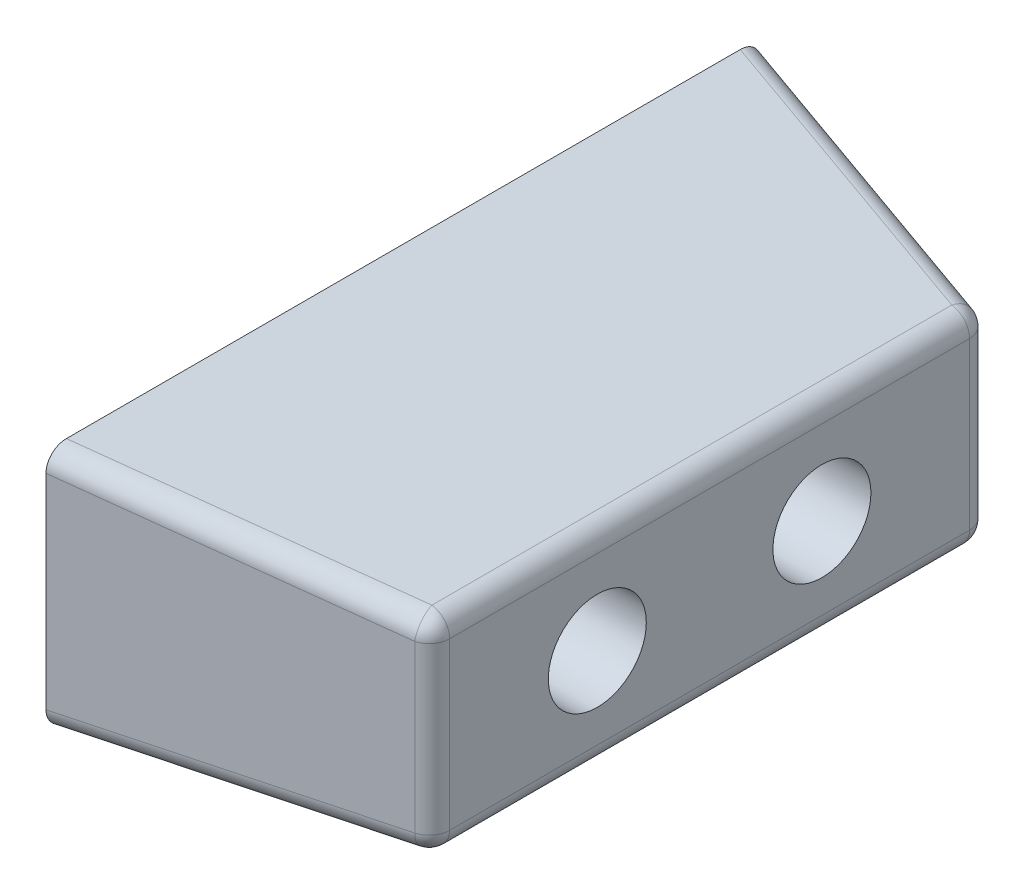
ISO-10303-21;
HEADER;
FILE_DESCRIPTION(('STEP AP214'),'2;1');
FILE_NAME('part.step','',(''),(''),'','','');
FILE_SCHEMA(('AUTOMOTIVE_DESIGN { 1 0 10303 214 1 1 1 1 }'));
ENDSEC;
DATA;
#1=APPLICATION_CONTEXT('core data for automotive mechanical design processes');
#2=APPLICATION_PROTOCOL_DEFINITION('international standard','automotive_design',2000,#1);
#3=PRODUCT_CONTEXT('',#1,'mechanical');
#4=PRODUCT('Part','Part','',(#3));
#5=PRODUCT_RELATED_PRODUCT_CATEGORY('part','',(#4));
#6=PRODUCT_DEFINITION_FORMATION('','',#4);
#7=PRODUCT_DEFINITION_CONTEXT('part definition',#1,'design');
#8=PRODUCT_DEFINITION('design','',#6,#7);
#9=PRODUCT_DEFINITION_SHAPE('','',#8);
#10=(LENGTH_UNIT() NAMED_UNIT(*) SI_UNIT(.MILLI.,.METRE.));
#11=(NAMED_UNIT(*) PLANE_ANGLE_UNIT() SI_UNIT($,.RADIAN.));
#12=(NAMED_UNIT(*) SI_UNIT($,.STERADIAN.) SOLID_ANGLE_UNIT());
#13=UNCERTAINTY_MEASURE_WITH_UNIT(LENGTH_MEASURE(1.E-05),#10,'distance_accuracy_value','');
#14=(GEOMETRIC_REPRESENTATION_CONTEXT(3) GLOBAL_UNCERTAINTY_ASSIGNED_CONTEXT((#13)) GLOBAL_UNIT_ASSIGNED_CONTEXT((#10,
#11,#12)) REPRESENTATION_CONTEXT('',''));
#15=CARTESIAN_POINT('',(0.,0.,0.));
#16=DIRECTION('',(0.,0.,1.));
#17=DIRECTION('',(1.,0.,0.));
#18=AXIS2_PLACEMENT_3D('',#15,#16,#17);
#19=CARTESIAN_POINT('',(0.,4.44089209850063E-13,87.5));
#20=DIRECTION('',(0.,1.,0.));
#21=DIRECTION('',(0.,0.,1.));
#22=AXIS2_PLACEMENT_3D('',#19,#20,#21);
#23=PLANE('',#22);
#24=DIRECTION('',(0.,0.,-1.));
#25=VECTOR('',#24,1.);
#26=CARTESIAN_POINT('',(0.,4.44089209850063E-13,87.5));
#27=LINE('',#26,#25);
#28=CARTESIAN_POINT('',(0.,4.44089209850063E-13,82.3252751012467));
#29=VERTEX_POINT('',#28);
#30=CARTESIAN_POINT('',(0.,4.44089209850063E-13,-82.3252751012466));
#31=VERTEX_POINT('',#30);
#32=EDGE_CURVE('E127',#29,#31,#27,.T.);
#33=ORIENTED_EDGE('',*,*,#32,.T.);
#34=DIRECTION('',(-0.966234939601246,0.,-0.257662650560332));
#35=VECTOR('',#34,1.);
#36=CARTESIAN_POINT('',(42.2801514774888,4.44089209850063E-13,-71.0505680405829));
#37=LINE('',#36,#35);
#38=CARTESIAN_POINT('',(69.9999999999999,4.44089209850063E-13,-63.6586084345799));
#39=VERTEX_POINT('',#38);
#40=EDGE_CURVE('E156',#31,#39,#37,.F.);
#41=ORIENTED_EDGE('',*,*,#40,.T.);
#42=DIRECTION('',(0.,0.,-1.));
#43=VECTOR('',#42,1.);
#44=CARTESIAN_POINT('',(69.9999999999999,4.44089209850063E-13,87.5));
#45=LINE('',#44,#43);
#46=CARTESIAN_POINT('',(69.9999999999999,4.44089209850063E-13,63.65860843458));
#47=VERTEX_POINT('',#46);
#48=EDGE_CURVE('E154',#39,#47,#45,.F.);
#49=ORIENTED_EDGE('',*,*,#48,.T.);
#50=DIRECTION('',(0.966234939601246,0.,-0.257662650560332));
#51=VECTOR('',#50,1.);
#52=CARTESIAN_POINT('',(-1.28831325280166,4.44089209850063E-13,82.6688253019938));
#53=LINE('',#52,#51);
#54=EDGE_CURVE('E152',#47,#29,#53,.F.);
#55=ORIENTED_EDGE('',*,*,#54,.T.);
#56=EDGE_LOOP('',(#33,#41,#49,#55));
#57=FACE_BOUND('',#56,.T.);
#58=ADVANCED_FACE('F34',(#57),#23,.F.);
#59=CARTESIAN_POINT('',(74.9999999999999,0.,87.5));
#60=DIRECTION('',(-1.,0.,0.));
#61=DIRECTION('',(0.,0.,1.));
#62=AXIS2_PLACEMENT_3D('',#59,#60,#61);
#63=PLANE('',#62);
#64=DIRECTION('',(0.,0.,-1.));
#65=VECTOR('',#64,1.);
#66=CARTESIAN_POINT('',(74.9999999999999,5.00000000000044,87.5));
#67=LINE('',#66,#65);
#68=CARTESIAN_POINT('',(74.9999999999999,5.00000000000044,63.65860843458));
#69=VERTEX_POINT('',#68);
#70=CARTESIAN_POINT('',(74.9999999999999,5.00000000000044,-63.65860843458));
#71=VERTEX_POINT('',#70);
#72=EDGE_CURVE('E162',#69,#71,#67,.T.);
#73=ORIENTED_EDGE('',*,*,#72,.T.);
#74=DIRECTION('',(0.,-1.,0.));
#75=VECTOR('',#74,1.);
#76=CARTESIAN_POINT('',(74.9999999999999,0.,-63.65860843458));
#77=LINE('',#76,#75);
#78=CARTESIAN_POINT('',(74.9999999999999,45.6224180165261,-63.65860843458));
#79=VERTEX_POINT('',#78);
#80=EDGE_CURVE('E164',#71,#79,#77,.F.);
#81=ORIENTED_EDGE('',*,*,#80,.T.);
#82=DIRECTION('',(0.,0.,-1.));
#83=VECTOR('',#82,1.);
#84=CARTESIAN_POINT('',(74.9999999999999,45.6224180165261,87.5));
#85=LINE('',#84,#83);
#86=CARTESIAN_POINT('',(74.9999999999999,45.6224180165261,63.65860843458));
#87=VERTEX_POINT('',#86);
#88=EDGE_CURVE('E158',#79,#87,#85,.F.);
#89=ORIENTED_EDGE('',*,*,#88,.T.);
#90=DIRECTION('',(0.,-1.,0.));
#91=VECTOR('',#90,1.);
#92=CARTESIAN_POINT('',(74.9999999999999,0.,63.65860843458));
#93=LINE('',#92,#91);
#94=EDGE_CURVE('E160',#87,#69,#93,.T.);
#95=ORIENTED_EDGE('',*,*,#94,.T.);
#96=EDGE_LOOP('',(#73,#81,#89,#95));
#97=FACE_BOUND('',#96,.T.);
#98=CARTESIAN_POINT('',(75.0000000000001,25.,27.5));
#99=DIRECTION('',(1.,0.,0.));
#100=DIRECTION('',(0.,0.,-1.));
#101=AXIS2_PLACEMENT_3D('',#98,#99,#100);
#102=CIRCLE('',#101,12.);
#103=CARTESIAN_POINT('',(75.0000000000001,25.,15.5));
#104=VERTEX_POINT('',#103);
#105=EDGE_CURVE('E219',#104,#104,#102,.T.);
#106=ORIENTED_EDGE('',*,*,#105,.F.);
#107=EDGE_LOOP('',(#106));
#108=FACE_BOUND('',#107,.T.);
#109=CARTESIAN_POINT('',(75.0000000000001,25.,-27.5));
#110=DIRECTION('',(1.,0.,0.));
#111=DIRECTION('',(0.,0.,1.));
#112=AXIS2_PLACEMENT_3D('',#109,#110,#111);
#113=CIRCLE('',#112,12.);
#114=CARTESIAN_POINT('',(75.0000000000001,25.,-39.5));
#115=VERTEX_POINT('',#114);
#116=EDGE_CURVE('E225',#115,#115,#113,.T.);
#117=ORIENTED_EDGE('',*,*,#116,.F.);
#118=EDGE_LOOP('',(#117));
#119=FACE_BOUND('',#118,.T.);
#120=ADVANCED_FACE('F253',(#97,#108,#119),#63,.F.);
#121=CARTESIAN_POINT('',(75.,49.9999999999999,87.4999999999999));
#122=DIRECTION('',(-0.132163720091018,-0.991227900682635,0.));
#123=DIRECTION('',(0.991227900682635,-0.132163720091018,0.));
#124=AXIS2_PLACEMENT_3D('',#121,#122,#123);
#125=PLANE('',#124);
#126=DIRECTION('',(0.,0.,-1.));
#127=VECTOR('',#126,1.);
#128=CARTESIAN_POINT('',(70.660818600455,50.5785575199393,87.4999999999999));
#129=LINE('',#128,#127);
#130=CARTESIAN_POINT('',(70.660818600455,50.5785575199393,63.65860843458));
#131=VERTEX_POINT('',#130);
#132=CARTESIAN_POINT('',(70.660818600455,50.5785575199393,-63.6586084345799));
#133=VERTEX_POINT('',#132);
#134=EDGE_CURVE('E133',#131,#133,#129,.T.);
#135=ORIENTED_EDGE('',*,*,#134,.T.);
#136=DIRECTION('',(-0.95831484749991,0.127775312999988,-0.255550625999976));
#137=VECTOR('',#136,1.);
#138=CARTESIAN_POINT('',(111.735059606866,45.1019920524179,-52.7054774995371));
#139=LINE('',#138,#137);
#140=CARTESIAN_POINT('',(0.,60.0000000000004,-82.5014933947013));
#141=VERTEX_POINT('',#140);
#142=EDGE_CURVE('E119',#133,#141,#139,.T.);
#143=ORIENTED_EDGE('',*,*,#142,.T.);
#144=DIRECTION('',(0.,0.,-1.));
#145=VECTOR('',#144,1.);
#146=CARTESIAN_POINT('',(0.,60.0000000000004,87.5));
#147=LINE('',#146,#145);
#148=CARTESIAN_POINT('',(0.,60.0000000000004,82.5014933947014));
#149=VERTEX_POINT('',#148);
#150=EDGE_CURVE('E114',#149,#141,#147,.T.);
#151=ORIENTED_EDGE('',*,*,#150,.F.);
#152=DIRECTION('',(0.95831484749991,-0.127775312999988,-0.255550625999976));
#153=VECTOR('',#152,1.);
#154=CARTESIAN_POINT('',(68.8779167497228,50.8162777667036,64.1340489281086));
#155=LINE('',#154,#153);
#156=EDGE_CURVE('E124',#149,#131,#155,.T.);
#157=ORIENTED_EDGE('',*,*,#156,.T.);
#158=EDGE_LOOP('',(#135,#143,#151,#157));
#159=FACE_BOUND('',#158,.T.);
#160=ADVANCED_FACE('F123',(#159),#125,.F.);
#161=CARTESIAN_POINT('',(0.,4.44089209850063E-13,87.5));
#162=DIRECTION('',(1.,0.,0.));
#163=DIRECTION('',(0.,0.,-1.));
#164=AXIS2_PLACEMENT_3D('',#161,#162,#163);
#165=PLANE('',#164);
#166=CARTESIAN_POINT('',(1.11022302462516E-13,25.,27.5));
#167=DIRECTION('',(1.,0.,0.));
#168=DIRECTION('',(0.,0.,-1.));
#169=AXIS2_PLACEMENT_3D('',#166,#167,#168);
#170=CIRCLE('',#169,5.5);
#171=CARTESIAN_POINT('',(1.11022302462516E-13,25.,22.));
#172=VERTEX_POINT('',#171);
#173=EDGE_CURVE('E137',#172,#172,#170,.T.);
#174=ORIENTED_EDGE('',*,*,#173,.T.);
#175=EDGE_LOOP('',(#174));
#176=FACE_BOUND('',#175,.T.);
#177=CARTESIAN_POINT('',(3.33066907387547E-13,25.,-27.5));
#178=DIRECTION('',(1.,0.,0.));
#179=DIRECTION('',(0.,0.,-1.));
#180=AXIS2_PLACEMENT_3D('',#177,#178,#179);
#181=CIRCLE('',#180,5.5);
#182=CARTESIAN_POINT('',(3.33066907387547E-13,25.,-33.));
#183=VERTEX_POINT('',#182);
#184=EDGE_CURVE('E212',#183,#183,#181,.T.);
#185=ORIENTED_EDGE('',*,*,#184,.T.);
#186=EDGE_LOOP('',(#185));
#187=FACE_BOUND('',#186,.T.);
#188=ORIENTED_EDGE('',*,*,#150,.T.);
#189=CARTESIAN_POINT('',(0.,54.9557513498594,-82.3252751012466));
#190=DIRECTION('',(1.,0.,0.));
#191=DIRECTION('',(0.,0.447213595499958,-0.894427190999916));
#192=AXIS2_PLACEMENT_3D('',#189,#190,#191);
#193=ELLIPSE('',#192,5.21749194749951,5.);
#194=CARTESIAN_POINT('',(0.,55.127526450233,-87.5));
#195=VERTEX_POINT('',#194);
#196=EDGE_CURVE('E144',#141,#195,#193,.F.);
#197=ORIENTED_EDGE('',*,*,#196,.T.);
#198=DIRECTION('',(0.,-1.,0.));
#199=VECTOR('',#198,1.);
#200=CARTESIAN_POINT('',(0.,0.,-87.5));
#201=LINE('',#200,#199);
#202=CARTESIAN_POINT('',(0.,5.00000000000045,-87.5));
#203=VERTEX_POINT('',#202);
#204=EDGE_CURVE('E218',#195,#203,#201,.T.);
#205=ORIENTED_EDGE('',*,*,#204,.T.);
#206=CARTESIAN_POINT('',(0.,5.00000000000045,-82.3252751012466));
#207=DIRECTION('',(1.,0.,0.));
#208=DIRECTION('',(0.,0.,-1.));
#209=AXIS2_PLACEMENT_3D('',#206,#207,#208);
#210=ELLIPSE('',#209,5.17472489875334,5.);
#211=EDGE_CURVE('E142',#203,#31,#210,.F.);
#212=ORIENTED_EDGE('',*,*,#211,.T.);
#213=ORIENTED_EDGE('',*,*,#32,.F.);
#214=CARTESIAN_POINT('',(0.,5.00000000000045,82.3252751012467));
#215=DIRECTION('',(1.,0.,0.));
#216=DIRECTION('',(0.,0.,-1.));
#217=AXIS2_PLACEMENT_3D('',#214,#215,#216);
#218=ELLIPSE('',#217,5.17472489875334,5.);
#219=CARTESIAN_POINT('',(0.,5.00000000000045,87.5));
#220=VERTEX_POINT('',#219);
#221=EDGE_CURVE('E118',#29,#220,#218,.F.);
#222=ORIENTED_EDGE('',*,*,#221,.T.);
#223=DIRECTION('',(0.,-1.,0.));
#224=VECTOR('',#223,1.);
#225=CARTESIAN_POINT('',(0.,4.44089209850063E-13,87.5));
#226=LINE('',#225,#224);
#227=CARTESIAN_POINT('',(0.,55.127526450233,87.5));
#228=VERTEX_POINT('',#227);
#229=EDGE_CURVE('E115',#228,#220,#226,.T.);
#230=ORIENTED_EDGE('',*,*,#229,.F.);
#231=CARTESIAN_POINT('',(0.,54.9557513498594,82.3252751012467));
#232=DIRECTION('',(1.,0.,0.));
#233=DIRECTION('',(0.,-0.447213595499958,-0.894427190999916));
#234=AXIS2_PLACEMENT_3D('',#231,#232,#233);
#235=ELLIPSE('',#234,5.21749194749951,5.);
#236=EDGE_CURVE('E111',#228,#149,#235,.F.);
#237=ORIENTED_EDGE('',*,*,#236,.T.);
#238=EDGE_LOOP('',(#188,#197,#205,#212,#213,#222,#230,#237));
#239=FACE_BOUND('',#238,.T.);
#240=ADVANCED_FACE('F113',(#176,#187,#239),#165,.F.);
#241=CARTESIAN_POINT('',(1.11022302462516E-13,175.,-87.4999999999999));
#242=DIRECTION('',(-0.257662650560332,0.,0.966234939601246));
#243=DIRECTION('',(0.966234939601246,0.,0.257662650560332));
#244=AXIS2_PLACEMENT_3D('',#241,#242,#243);
#245=PLANE('',#244);
#246=ORIENTED_EDGE('',*,*,#204,.F.);
#247=DIRECTION('',(-0.95831484749991,0.127775312999988,-0.255550625999976));
#248=VECTOR('',#247,1.);
#249=CARTESIAN_POINT('',(-14.6782620673183,57.0846280592088,-91.4142032179515));
#250=LINE('',#249,#248);
#251=CARTESIAN_POINT('',(71.2883132528016,45.6224180165261,-68.4897831325862));
#252=VERTEX_POINT('',#251);
#253=EDGE_CURVE('E150',#195,#252,#250,.F.);
#254=ORIENTED_EDGE('',*,*,#253,.T.);
#255=DIRECTION('',(0.,-1.,0.));
#256=VECTOR('',#255,1.);
#257=CARTESIAN_POINT('',(71.2883132528016,175.,-68.4897831325862));
#258=LINE('',#257,#256);
#259=CARTESIAN_POINT('',(71.2883132528016,5.00000000000045,-68.4897831325862));
#260=VERTEX_POINT('',#259);
#261=EDGE_CURVE('E146',#252,#260,#258,.T.);
#262=ORIENTED_EDGE('',*,*,#261,.T.);
#263=DIRECTION('',(-0.966234939601246,0.,-0.257662650560332));
#264=VECTOR('',#263,1.);
#265=CARTESIAN_POINT('',(1.11022302462516E-13,5.00000000000045,-87.4999999999999));
#266=LINE('',#265,#264);
#267=EDGE_CURVE('E148',#260,#203,#266,.T.);
#268=ORIENTED_EDGE('',*,*,#267,.T.);
#269=EDGE_LOOP('',(#246,#254,#262,#268));
#270=FACE_BOUND('',#269,.T.);
#271=ADVANCED_FACE('F313',(#270),#245,.F.);
#272=CARTESIAN_POINT('',(0.,175.,87.5));
#273=DIRECTION('',(-0.257662650560332,0.,-0.966234939601246));
#274=DIRECTION('',(-0.966234939601246,0.,0.257662650560332));
#275=AXIS2_PLACEMENT_3D('',#272,#273,#274);
#276=PLANE('',#275);
#277=ORIENTED_EDGE('',*,*,#229,.T.);
#278=DIRECTION('',(0.966234939601246,0.,-0.257662650560332));
#279=VECTOR('',#278,1.);
#280=CARTESIAN_POINT('',(0.,5.00000000000045,87.5));
#281=LINE('',#280,#279);
#282=CARTESIAN_POINT('',(71.2883132528016,5.00000000000045,68.4897831325863));
#283=VERTEX_POINT('',#282);
#284=EDGE_CURVE('E11',#220,#283,#281,.T.);
#285=ORIENTED_EDGE('',*,*,#284,.T.);
#286=DIRECTION('',(0.,-1.,0.));
#287=VECTOR('',#286,1.);
#288=CARTESIAN_POINT('',(71.2883132528016,175.,68.4897831325863));
#289=LINE('',#288,#287);
#290=CARTESIAN_POINT('',(71.2883132528016,45.6224180165261,68.4897831325863));
#291=VERTEX_POINT('',#290);
#292=EDGE_CURVE('E43',#283,#291,#289,.F.);
#293=ORIENTED_EDGE('',*,*,#292,.T.);
#294=DIRECTION('',(0.95831484749991,-0.127775312999988,-0.255550625999976));
#295=VECTOR('',#294,1.);
#296=CARTESIAN_POINT('',(-14.6782620673184,57.0846280592088,91.4142032179516));
#297=LINE('',#296,#295);
#298=EDGE_CURVE('E167',#291,#228,#297,.F.);
#299=ORIENTED_EDGE('',*,*,#298,.T.);
#300=EDGE_LOOP('',(#277,#285,#293,#299));
#301=FACE_BOUND('',#300,.T.);
#302=ADVANCED_FACE('F325',(#301),#276,.F.);
#303=CARTESIAN_POINT('',(23.,25.,-27.5));
#304=DIRECTION('',(1.,0.,0.));
#305=DIRECTION('',(0.,0.,-1.));
#306=AXIS2_PLACEMENT_3D('',#303,#304,#305);
#307=CYLINDRICAL_SURFACE('',#306,12.);
#308=CARTESIAN_POINT('',(23.,25.,-27.5));
#309=DIRECTION('',(1.,0.,0.));
#310=DIRECTION('',(0.,0.,1.));
#311=AXIS2_PLACEMENT_3D('',#308,#309,#310);
#312=CIRCLE('',#311,12.);
#313=CARTESIAN_POINT('',(23.,25.,-39.5));
#314=VERTEX_POINT('',#313);
#315=EDGE_CURVE('E222',#314,#314,#312,.T.);
#316=CARTESIAN_POINT('',(23.,25.,-39.5));
#317=CARTESIAN_POINT('',(23.5416666666667,25.,-39.5));
#318=CARTESIAN_POINT('',(24.0833333333334,25.,-39.5));
#319=CARTESIAN_POINT('',(25.1666666666667,25.,-39.5));
#320=CARTESIAN_POINT('',(25.7083333333334,25.,-39.5));
#321=CARTESIAN_POINT('',(26.7916666666667,25.,-39.5));
#322=CARTESIAN_POINT('',(27.3333333333334,25.,-39.5));
#323=CARTESIAN_POINT('',(28.4166666666667,25.,-39.5));
#324=CARTESIAN_POINT('',(28.9583333333334,25.,-39.5));
#325=CARTESIAN_POINT('',(30.0416666666667,25.,-39.5));
#326=CARTESIAN_POINT('',(30.5833333333334,25.,-39.5));
#327=CARTESIAN_POINT('',(31.6666666666667,25.,-39.5));
#328=CARTESIAN_POINT('',(32.2083333333334,25.,-39.5));
#329=CARTESIAN_POINT('',(33.2916666666667,25.,-39.5));
#330=CARTESIAN_POINT('',(33.8333333333334,25.,-39.5));
#331=CARTESIAN_POINT('',(34.9166666666667,25.,-39.5));
#332=CARTESIAN_POINT('',(35.4583333333334,25.,-39.5));
#333=CARTESIAN_POINT('',(36.5416666666667,25.,-39.5));
#334=CARTESIAN_POINT('',(37.0833333333334,25.,-39.5));
#335=CARTESIAN_POINT('',(38.1666666666667,25.,-39.5));
#336=CARTESIAN_POINT('',(38.7083333333334,25.,-39.5));
#337=CARTESIAN_POINT('',(39.7916666666667,25.,-39.5));
#338=CARTESIAN_POINT('',(40.3333333333334,25.,-39.5));
#339=CARTESIAN_POINT('',(41.4166666666667,25.,-39.5));
#340=CARTESIAN_POINT('',(41.9583333333334,25.,-39.5));
#341=CARTESIAN_POINT('',(43.0416666666667,25.,-39.5));
#342=CARTESIAN_POINT('',(43.5833333333334,25.,-39.5));
#343=CARTESIAN_POINT('',(44.6666666666667,25.,-39.5));
#344=CARTESIAN_POINT('',(45.2083333333334,25.,-39.5));
#345=CARTESIAN_POINT('',(46.2916666666667,25.,-39.5));
#346=CARTESIAN_POINT('',(46.8333333333334,25.,-39.5));
#347=CARTESIAN_POINT('',(47.9166666666667,25.,-39.5));
#348=CARTESIAN_POINT('',(48.4583333333334,25.,-39.5));
#349=CARTESIAN_POINT('',(49.5416666666667,25.,-39.5));
#350=CARTESIAN_POINT('',(50.0833333333334,25.,-39.5));
#351=CARTESIAN_POINT('',(51.1666666666667,25.,-39.5));
#352=CARTESIAN_POINT('',(51.7083333333334,25.,-39.5));
#353=CARTESIAN_POINT('',(52.7916666666667,25.,-39.5));
#354=CARTESIAN_POINT('',(53.3333333333334,25.,-39.5));
#355=CARTESIAN_POINT('',(54.4166666666667,25.,-39.5));
#356=CARTESIAN_POINT('',(54.9583333333334,25.,-39.5));
#357=CARTESIAN_POINT('',(56.0416666666667,25.,-39.5));
#358=CARTESIAN_POINT('',(56.5833333333334,25.,-39.5));
#359=CARTESIAN_POINT('',(57.6666666666667,25.,-39.5));
#360=CARTESIAN_POINT('',(58.2083333333334,25.,-39.5));
#361=CARTESIAN_POINT('',(59.2916666666667,25.,-39.5));
#362=CARTESIAN_POINT('',(59.8333333333334,25.,-39.5));
#363=CARTESIAN_POINT('',(60.9166666666667,25.,-39.5));
#364=CARTESIAN_POINT('',(61.4583333333334,25.,-39.5));
#365=CARTESIAN_POINT('',(62.5416666666667,25.,-39.5));
#366=CARTESIAN_POINT('',(63.0833333333334,25.,-39.5));
#367=CARTESIAN_POINT('',(64.1666666666667,25.,-39.5));
#368=CARTESIAN_POINT('',(64.7083333333334,25.,-39.5));
#369=CARTESIAN_POINT('',(65.7916666666667,25.,-39.5));
#370=CARTESIAN_POINT('',(66.3333333333334,25.,-39.5));
#371=CARTESIAN_POINT('',(67.4166666666667,25.,-39.5));
#372=CARTESIAN_POINT('',(67.9583333333334,25.,-39.5));
#373=CARTESIAN_POINT('',(69.0416666666667,25.,-39.5));
#374=CARTESIAN_POINT('',(69.5833333333334,25.,-39.5));
#375=CARTESIAN_POINT('',(70.6666666666667,25.,-39.5));
#376=CARTESIAN_POINT('',(71.2083333333334,25.,-39.5));
#377=CARTESIAN_POINT('',(72.2916666666667,25.,-39.5));
#378=CARTESIAN_POINT('',(72.8333333333334,25.,-39.5));
#379=CARTESIAN_POINT('',(73.9166666666667,25.,-39.5));
#380=CARTESIAN_POINT('',(74.4583333333334,25.,-39.5));
#381=CARTESIAN_POINT('',(75.0000000000001,25.,-39.5));
#382=B_SPLINE_CURVE_WITH_KNOTS('',3,(#316,#317,#318,#319,#320,#321,#322,#323,#324,#325,#326,
#327,#328,#329,#330,#331,#332,#333,#334,#335,#336,#337,#338,#339,#340,#341,#342,#343,#344,#345,
#346,#347,#348,#349,#350,#351,#352,#353,#354,#355,#356,#357,#358,#359,#360,#361,#362,#363,#364,
#365,#366,#367,#368,#369,#370,#371,#372,#373,#374,#375,#376,#377,#378,#379,#380,#381),
.UNSPECIFIED.,.F.,.F.,(4,2,2,2,2,2,2,2,2,2,2,2,2,2,2,2,2,2,2,2,2,2,2,2,2,2,2,2,2,2,2,2,4),(0.,
1.625,3.25000000000001,4.87500000000001,6.50000000000001,8.12500000000001,9.75000000000001,
11.375,13.,14.625,16.25,17.875,19.5,21.125,22.75,24.375,26.,27.625,29.25,30.875,32.5,34.125,
35.75,37.375,39.,40.625,42.25,43.875,45.5,47.1250000000001,48.75,50.3750000000001,52.),.UNSPECIFIED.);
#383=EDGE_CURVE('BSEAM327',#314,#115,#382,.T.);
#384=ORIENTED_EDGE('',*,*,#315,.F.);
#385=ORIENTED_EDGE('',*,*,#116,.T.);
#386=ORIENTED_EDGE('',*,*,#383,.T.);
#387=ORIENTED_EDGE('',*,*,#383,.F.);
#388=EDGE_LOOP('',(#384,#386,#385,#387));
#389=FACE_BOUND('',#388,.T.);
#390=ADVANCED_FACE('F327',(#389),#307,.F.);
#391=CARTESIAN_POINT('',(23.,25.,-27.5));
#392=DIRECTION('',(-1.,0.,0.));
#393=DIRECTION('',(0.,0.,1.));
#394=AXIS2_PLACEMENT_3D('',#391,#392,#393);
#395=PLANE('',#394);
#396=CARTESIAN_POINT('',(23.,25.,-27.5));
#397=DIRECTION('',(1.,0.,0.));
#398=DIRECTION('',(0.,0.,-1.));
#399=AXIS2_PLACEMENT_3D('',#396,#397,#398);
#400=CIRCLE('',#399,5.5);
#401=CARTESIAN_POINT('',(23.,25.,-33.));
#402=VERTEX_POINT('',#401);
#403=EDGE_CURVE('E203',#402,#402,#400,.T.);
#404=ORIENTED_EDGE('',*,*,#403,.F.);
#405=EDGE_LOOP('',(#404));
#406=FACE_BOUND('',#405,.T.);
#407=ORIENTED_EDGE('',*,*,#315,.T.);
#408=EDGE_LOOP('',(#407));
#409=FACE_BOUND('',#408,.T.);
#410=ADVANCED_FACE('F333',(#406,#409),#395,.F.);
#411=CARTESIAN_POINT('',(23.,25.,27.5));
#412=DIRECTION('',(1.,0.,0.));
#413=DIRECTION('',(0.,0.,-1.));
#414=AXIS2_PLACEMENT_3D('',#411,#412,#413);
#415=CYLINDRICAL_SURFACE('',#414,12.);
#416=CARTESIAN_POINT('',(23.,25.,27.5));
#417=DIRECTION('',(1.,0.,0.));
#418=DIRECTION('',(0.,0.,-1.));
#419=AXIS2_PLACEMENT_3D('',#416,#417,#418);
#420=CIRCLE('',#419,12.);
#421=CARTESIAN_POINT('',(23.,25.,15.5));
#422=VERTEX_POINT('',#421);
#423=EDGE_CURVE('E215',#422,#422,#420,.T.);
#424=CARTESIAN_POINT('',(23.,25.,15.5));
#425=CARTESIAN_POINT('',(23.5416666666667,25.,15.5));
#426=CARTESIAN_POINT('',(24.0833333333334,25.,15.5));
#427=CARTESIAN_POINT('',(25.1666666666667,25.,15.5));
#428=CARTESIAN_POINT('',(25.7083333333334,25.,15.5));
#429=CARTESIAN_POINT('',(26.7916666666667,25.,15.5));
#430=CARTESIAN_POINT('',(27.3333333333334,25.,15.5));
#431=CARTESIAN_POINT('',(28.4166666666667,25.,15.5));
#432=CARTESIAN_POINT('',(28.9583333333334,25.,15.5));
#433=CARTESIAN_POINT('',(30.0416666666667,25.,15.5));
#434=CARTESIAN_POINT('',(30.5833333333334,25.,15.5));
#435=CARTESIAN_POINT('',(31.6666666666667,25.,15.5));
#436=CARTESIAN_POINT('',(32.2083333333334,25.,15.5));
#437=CARTESIAN_POINT('',(33.2916666666667,25.,15.5));
#438=CARTESIAN_POINT('',(33.8333333333334,25.,15.5));
#439=CARTESIAN_POINT('',(34.9166666666667,25.,15.5));
#440=CARTESIAN_POINT('',(35.4583333333334,25.,15.5));
#441=CARTESIAN_POINT('',(36.5416666666667,25.,15.5));
#442=CARTESIAN_POINT('',(37.0833333333334,25.,15.5));
#443=CARTESIAN_POINT('',(38.1666666666667,25.,15.5));
#444=CARTESIAN_POINT('',(38.7083333333334,25.,15.5));
#445=CARTESIAN_POINT('',(39.7916666666667,25.,15.5));
#446=CARTESIAN_POINT('',(40.3333333333334,25.,15.5));
#447=CARTESIAN_POINT('',(41.4166666666667,25.,15.5));
#448=CARTESIAN_POINT('',(41.9583333333334,25.,15.5));
#449=CARTESIAN_POINT('',(43.0416666666667,25.,15.5));
#450=CARTESIAN_POINT('',(43.5833333333334,25.,15.5));
#451=CARTESIAN_POINT('',(44.6666666666667,25.,15.5));
#452=CARTESIAN_POINT('',(45.2083333333334,25.,15.5));
#453=CARTESIAN_POINT('',(46.2916666666667,25.,15.5));
#454=CARTESIAN_POINT('',(46.8333333333334,25.,15.5));
#455=CARTESIAN_POINT('',(47.9166666666667,25.,15.5));
#456=CARTESIAN_POINT('',(48.4583333333334,25.,15.5));
#457=CARTESIAN_POINT('',(49.5416666666667,25.,15.5));
#458=CARTESIAN_POINT('',(50.0833333333334,25.,15.5));
#459=CARTESIAN_POINT('',(51.1666666666667,25.,15.5));
#460=CARTESIAN_POINT('',(51.7083333333334,25.,15.5));
#461=CARTESIAN_POINT('',(52.7916666666667,25.,15.5));
#462=CARTESIAN_POINT('',(53.3333333333334,25.,15.5));
#463=CARTESIAN_POINT('',(54.4166666666667,25.,15.5));
#464=CARTESIAN_POINT('',(54.9583333333334,25.,15.5));
#465=CARTESIAN_POINT('',(56.0416666666667,25.,15.5));
#466=CARTESIAN_POINT('',(56.5833333333334,25.,15.5));
#467=CARTESIAN_POINT('',(57.6666666666667,25.,15.5));
#468=CARTESIAN_POINT('',(58.2083333333334,25.,15.5));
#469=CARTESIAN_POINT('',(59.2916666666667,25.,15.5));
#470=CARTESIAN_POINT('',(59.8333333333334,25.,15.5));
#471=CARTESIAN_POINT('',(60.9166666666667,25.,15.5));
#472=CARTESIAN_POINT('',(61.4583333333334,25.,15.5));
#473=CARTESIAN_POINT('',(62.5416666666667,25.,15.5));
#474=CARTESIAN_POINT('',(63.0833333333334,25.,15.5));
#475=CARTESIAN_POINT('',(64.1666666666667,25.,15.5));
#476=CARTESIAN_POINT('',(64.7083333333334,25.,15.5));
#477=CARTESIAN_POINT('',(65.7916666666667,25.,15.5));
#478=CARTESIAN_POINT('',(66.3333333333334,25.,15.5));
#479=CARTESIAN_POINT('',(67.4166666666667,25.,15.5));
#480=CARTESIAN_POINT('',(67.9583333333334,25.,15.5));
#481=CARTESIAN_POINT('',(69.0416666666667,25.,15.5));
#482=CARTESIAN_POINT('',(69.5833333333334,25.,15.5));
#483=CARTESIAN_POINT('',(70.6666666666667,25.,15.5));
#484=CARTESIAN_POINT('',(71.2083333333334,25.,15.5));
#485=CARTESIAN_POINT('',(72.2916666666667,25.,15.5));
#486=CARTESIAN_POINT('',(72.8333333333334,25.,15.5));
#487=CARTESIAN_POINT('',(73.9166666666667,25.,15.5));
#488=CARTESIAN_POINT('',(74.4583333333334,25.,15.5));
#489=CARTESIAN_POINT('',(75.0000000000001,25.,15.5));
#490=B_SPLINE_CURVE_WITH_KNOTS('',3,(#424,#425,#426,#427,#428,#429,#430,#431,#432,#433,#434,
#435,#436,#437,#438,#439,#440,#441,#442,#443,#444,#445,#446,#447,#448,#449,#450,#451,#452,#453,
#454,#455,#456,#457,#458,#459,#460,#461,#462,#463,#464,#465,#466,#467,#468,#469,#470,#471,#472,
#473,#474,#475,#476,#477,#478,#479,#480,#481,#482,#483,#484,#485,#486,#487,#488,#489),
.UNSPECIFIED.,.F.,.F.,(4,2,2,2,2,2,2,2,2,2,2,2,2,2,2,2,2,2,2,2,2,2,2,2,2,2,2,2,2,2,2,2,4),(0.,
1.625,3.25000000000001,4.87500000000001,6.50000000000001,8.12500000000001,9.75000000000001,
11.375,13.,14.625,16.25,17.875,19.5,21.125,22.75,24.375,26.,27.625,29.25,30.875,32.5,34.125,
35.75,37.375,39.,40.625,42.25,43.875,45.5,47.1250000000001,48.75,50.3750000000001,52.),.UNSPECIFIED.);
#491=EDGE_CURVE('BSEAM447',#422,#104,#490,.T.);
#492=ORIENTED_EDGE('',*,*,#423,.F.);
#493=ORIENTED_EDGE('',*,*,#105,.T.);
#494=ORIENTED_EDGE('',*,*,#491,.T.);
#495=ORIENTED_EDGE('',*,*,#491,.F.);
#496=EDGE_LOOP('',(#492,#494,#493,#495));
#497=FACE_BOUND('',#496,.T.);
#498=ADVANCED_FACE('F447',(#497),#415,.F.);
#499=CARTESIAN_POINT('',(23.,25.,27.5));
#500=DIRECTION('',(1.,0.,0.));
#501=DIRECTION('',(0.,0.,-1.));
#502=AXIS2_PLACEMENT_3D('',#499,#500,#501);
#503=PLANE('',#502);
#504=CARTESIAN_POINT('',(23.,25.,27.5));
#505=DIRECTION('',(1.,0.,0.));
#506=DIRECTION('',(0.,0.,-1.));
#507=AXIS2_PLACEMENT_3D('',#504,#505,#506);
#508=CIRCLE('',#507,5.5);
#509=CARTESIAN_POINT('',(23.,25.,22.));
#510=VERTEX_POINT('',#509);
#511=EDGE_CURVE('E207',#510,#510,#508,.T.);
#512=ORIENTED_EDGE('',*,*,#511,.F.);
#513=EDGE_LOOP('',(#512));
#514=FACE_BOUND('',#513,.T.);
#515=ORIENTED_EDGE('',*,*,#423,.T.);
#516=EDGE_LOOP('',(#515));
#517=FACE_BOUND('',#516,.T.);
#518=ADVANCED_FACE('F250',(#514,#517),#503,.T.);
#519=CARTESIAN_POINT('',(-16.9999999999996,25.,-27.5));
#520=DIRECTION('',(1.,0.,0.));
#521=DIRECTION('',(0.,0.,-1.));
#522=AXIS2_PLACEMENT_3D('',#519,#520,#521);
#523=CYLINDRICAL_SURFACE('',#522,5.5);
#524=ORIENTED_EDGE('',*,*,#403,.T.);
#525=EDGE_LOOP('',(#524));
#526=FACE_BOUND('',#525,.T.);
#527=ORIENTED_EDGE('',*,*,#184,.F.);
#528=EDGE_LOOP('',(#527));
#529=FACE_BOUND('',#528,.T.);
#530=ADVANCED_FACE('F241',(#526,#529),#523,.F.);
#531=CARTESIAN_POINT('',(-16.9999999999998,25.,27.5));
#532=DIRECTION('',(1.,0.,0.));
#533=DIRECTION('',(0.,0.,-1.));
#534=AXIS2_PLACEMENT_3D('',#531,#532,#533);
#535=CYLINDRICAL_SURFACE('',#534,5.5);
#536=ORIENTED_EDGE('',*,*,#511,.T.);
#537=EDGE_LOOP('',(#536));
#538=FACE_BOUND('',#537,.T.);
#539=ORIENTED_EDGE('',*,*,#173,.F.);
#540=EDGE_LOOP('',(#539));
#541=FACE_BOUND('',#540,.T.);
#542=ADVANCED_FACE('F239',(#538,#541),#535,.F.);
#543=CARTESIAN_POINT('',(-1.28831325280166,5.00000000000045,82.6688253019938));
#544=DIRECTION('',(0.966234939601246,0.,-0.257662650560332));
#545=DIRECTION('',(-0.257662650560332,0.,-0.966234939601246));
#546=AXIS2_PLACEMENT_3D('',#543,#544,#545);
#547=CYLINDRICAL_SURFACE('',#546,5.);
#548=CARTESIAN_POINT('',(69.9999999999999,5.00000000000045,63.65860843458));
#549=DIRECTION('',(0.966234939601246,0.,-0.257662650560334));
#550=DIRECTION('',(-0.257662650560334,0.,-0.966234939601246));
#551=AXIS2_PLACEMENT_3D('',#548,#549,#550);
#552=CIRCLE('',#551,5.);
#553=EDGE_CURVE('E38',#283,#47,#552,.T.);
#554=ORIENTED_EDGE('',*,*,#553,.F.);
#555=ORIENTED_EDGE('',*,*,#284,.F.);
#556=ORIENTED_EDGE('',*,*,#221,.F.);
#557=ORIENTED_EDGE('',*,*,#54,.F.);
#558=EDGE_LOOP('',(#554,#555,#556,#557));
#559=FACE_BOUND('',#558,.T.);
#560=ADVANCED_FACE('F36',(#559),#547,.T.);
#561=CARTESIAN_POINT('',(69.9999999999999,5.00000000000044,63.65860843458));
#562=DIRECTION('',(0.,0.,1.));
#563=DIRECTION('',(1.,0.,0.));
#564=AXIS2_PLACEMENT_3D('',#561,#562,#563);
#565=SPHERICAL_SURFACE('',#564,5.);
#566=CARTESIAN_POINT('',(69.9999999999999,5.00000000000044,63.65860843458));
#567=DIRECTION('',(0.,-1.,0.));
#568=DIRECTION('',(0.,0.,-1.));
#569=AXIS2_PLACEMENT_3D('',#566,#567,#568);
#570=CIRCLE('',#569,5.);
#571=EDGE_CURVE('E194',#283,#69,#570,.F.);
#572=ORIENTED_EDGE('',*,*,#571,.F.);
#573=ORIENTED_EDGE('',*,*,#553,.T.);
#574=CARTESIAN_POINT('',(69.9999999999999,5.00000000000044,63.65860843458));
#575=DIRECTION('',(0.,0.,1.));
#576=DIRECTION('',(1.,0.,0.));
#577=AXIS2_PLACEMENT_3D('',#574,#575,#576);
#578=CIRCLE('',#577,5.);
#579=EDGE_CURVE('E196',#69,#47,#578,.F.);
#580=ORIENTED_EDGE('',*,*,#579,.F.);
#581=EDGE_LOOP('',(#572,#573,#580));
#582=FACE_BOUND('',#581,.T.);
#583=ADVANCED_FACE('F248',(#582),#565,.T.);
#584=CARTESIAN_POINT('',(-1.28831325280155,5.00000000000045,-82.6688253019937));
#585=DIRECTION('',(-0.966234939601246,0.,-0.257662650560332));
#586=DIRECTION('',(-0.257662650560332,0.,0.966234939601246));
#587=AXIS2_PLACEMENT_3D('',#584,#585,#586);
#588=CYLINDRICAL_SURFACE('',#587,5.);
#589=ORIENTED_EDGE('',*,*,#211,.F.);
#590=ORIENTED_EDGE('',*,*,#267,.F.);
#591=CARTESIAN_POINT('',(69.9999999999999,5.00000000000044,-63.6586084345799));
#592=DIRECTION('',(0.966234939601247,0.,0.25766265056033));
#593=DIRECTION('',(0.25766265056033,0.,-0.966234939601247));
#594=AXIS2_PLACEMENT_3D('',#591,#592,#593);
#595=CIRCLE('',#594,5.);
#596=EDGE_CURVE('E191',#39,#260,#595,.T.);
#597=ORIENTED_EDGE('',*,*,#596,.F.);
#598=ORIENTED_EDGE('',*,*,#40,.F.);
#599=EDGE_LOOP('',(#589,#590,#597,#598));
#600=FACE_BOUND('',#599,.T.);
#601=ADVANCED_FACE('F296',(#600),#588,.T.);
#602=CARTESIAN_POINT('',(69.9999999999999,5.00000000000044,87.5));
#603=DIRECTION('',(0.,0.,-1.));
#604=DIRECTION('',(-1.,0.,0.));
#605=AXIS2_PLACEMENT_3D('',#602,#603,#604);
#606=CYLINDRICAL_SURFACE('',#605,5.);
#607=ORIENTED_EDGE('',*,*,#579,.T.);
#608=ORIENTED_EDGE('',*,*,#48,.F.);
#609=CARTESIAN_POINT('',(69.9999999999999,5.00000000000044,-63.65860843458));
#610=DIRECTION('',(0.,0.,-1.));
#611=DIRECTION('',(0.,1.,0.));
#612=AXIS2_PLACEMENT_3D('',#609,#610,#611);
#613=CIRCLE('',#612,5.);
#614=EDGE_CURVE('E188',#71,#39,#613,.T.);
#615=ORIENTED_EDGE('',*,*,#614,.F.);
#616=ORIENTED_EDGE('',*,*,#72,.F.);
#617=EDGE_LOOP('',(#607,#608,#615,#616));
#618=FACE_BOUND('',#617,.T.);
#619=ADVANCED_FACE('F292',(#618),#606,.T.);
#620=CARTESIAN_POINT('',(69.9999999999999,0.,63.65860843458));
#621=DIRECTION('',(0.,-1.,0.));
#622=DIRECTION('',(1.,0.,0.));
#623=AXIS2_PLACEMENT_3D('',#620,#621,#622);
#624=CYLINDRICAL_SURFACE('',#623,5.);
#625=ORIENTED_EDGE('',*,*,#571,.T.);
#626=ORIENTED_EDGE('',*,*,#94,.F.);
#627=CARTESIAN_POINT('',(69.9999999999999,45.6224180165261,63.65860843458));
#628=DIRECTION('',(0.,1.,0.));
#629=DIRECTION('',(0.,0.,1.));
#630=AXIS2_PLACEMENT_3D('',#627,#628,#629);
#631=CIRCLE('',#630,5.);
#632=EDGE_CURVE('E185',#291,#87,#631,.T.);
#633=ORIENTED_EDGE('',*,*,#632,.F.);
#634=ORIENTED_EDGE('',*,*,#292,.F.);
#635=EDGE_LOOP('',(#625,#626,#633,#634));
#636=FACE_BOUND('',#635,.T.);
#637=ADVANCED_FACE('F289',(#636),#624,.T.);
#638=CARTESIAN_POINT('',(68.2170981492677,45.8601382632904,64.1340489281086));
#639=DIRECTION('',(0.95831484749991,-0.127775312999988,-0.255550625999976));
#640=DIRECTION('',(-0.257662650560332,0.,-0.966234939601246));
#641=AXIS2_PLACEMENT_3D('',#638,#639,#640);
#642=CYLINDRICAL_SURFACE('',#641,5.);
#643=ORIENTED_EDGE('',*,*,#236,.F.);
#644=ORIENTED_EDGE('',*,*,#298,.F.);
#645=CARTESIAN_POINT('',(69.9999999999999,45.6224180165261,63.65860843458));
#646=DIRECTION('',(0.958314847499909,-0.127775312999989,-0.255550625999977));
#647=DIRECTION('',(-0.257662650560334,0.,-0.966234939601246));
#648=AXIS2_PLACEMENT_3D('',#645,#646,#647);
#649=CIRCLE('',#648,5.);
#650=EDGE_CURVE('E131',#131,#291,#649,.T.);
#651=ORIENTED_EDGE('',*,*,#650,.F.);
#652=ORIENTED_EDGE('',*,*,#156,.F.);
#653=EDGE_LOOP('',(#643,#644,#651,#652));
#654=FACE_BOUND('',#653,.T.);
#655=ADVANCED_FACE('F129',(#654),#642,.T.);
#656=CARTESIAN_POINT('',(69.9999999999999,5.00000000000044,-63.6586084345799));
#657=DIRECTION('',(0.,0.,1.));
#658=DIRECTION('',(1.,0.,0.));
#659=AXIS2_PLACEMENT_3D('',#656,#657,#658);
#660=SPHERICAL_SURFACE('',#659,5.);
#661=ORIENTED_EDGE('',*,*,#614,.T.);
#662=ORIENTED_EDGE('',*,*,#596,.T.);
#663=CARTESIAN_POINT('',(69.9999999999999,5.00000000000045,-63.65860843458));
#664=DIRECTION('',(0.,-1.,0.));
#665=DIRECTION('',(1.,0.,0.));
#666=AXIS2_PLACEMENT_3D('',#663,#664,#665);
#667=CIRCLE('',#666,5.);
#668=EDGE_CURVE('E181',#71,#260,#667,.F.);
#669=ORIENTED_EDGE('',*,*,#668,.F.);
#670=EDGE_LOOP('',(#661,#662,#669));
#671=FACE_BOUND('',#670,.T.);
#672=ADVANCED_FACE('F282',(#671),#660,.T.);
#673=CARTESIAN_POINT('',(69.9999999999999,45.6224180165261,63.65860843458));
#674=DIRECTION('',(0.,0.,1.));
#675=DIRECTION('',(1.,0.,0.));
#676=AXIS2_PLACEMENT_3D('',#673,#674,#675);
#677=SPHERICAL_SURFACE('',#676,5.);
#678=ORIENTED_EDGE('',*,*,#650,.T.);
#679=ORIENTED_EDGE('',*,*,#632,.T.);
#680=CARTESIAN_POINT('',(69.9999999999999,45.6224180165261,63.65860843458));
#681=DIRECTION('',(0.,0.,1.));
#682=DIRECTION('',(1.,0.,0.));
#683=AXIS2_PLACEMENT_3D('',#680,#681,#682);
#684=CIRCLE('',#683,5.);
#685=EDGE_CURVE('E178',#131,#87,#684,.F.);
#686=ORIENTED_EDGE('',*,*,#685,.F.);
#687=EDGE_LOOP('',(#678,#679,#686));
#688=FACE_BOUND('',#687,.T.);
#689=ADVANCED_FACE('F278',(#688),#677,.T.);
#690=CARTESIAN_POINT('',(69.9999999999999,175.,-63.65860843458));
#691=DIRECTION('',(0.,-1.,0.));
#692=DIRECTION('',(1.,0.,0.));
#693=AXIS2_PLACEMENT_3D('',#690,#691,#692);
#694=CYLINDRICAL_SURFACE('',#693,5.);
#695=ORIENTED_EDGE('',*,*,#668,.T.);
#696=ORIENTED_EDGE('',*,*,#261,.F.);
#697=CARTESIAN_POINT('',(69.9999999999999,45.6224180165261,-63.65860843458));
#698=DIRECTION('',(0.,1.,0.));
#699=DIRECTION('',(0.,0.,1.));
#700=AXIS2_PLACEMENT_3D('',#697,#698,#699);
#701=CIRCLE('',#700,5.);
#702=EDGE_CURVE('E175',#79,#252,#701,.T.);
#703=ORIENTED_EDGE('',*,*,#702,.F.);
#704=ORIENTED_EDGE('',*,*,#80,.F.);
#705=EDGE_LOOP('',(#695,#696,#703,#704));
#706=FACE_BOUND('',#705,.T.);
#707=ADVANCED_FACE('F274',(#706),#694,.T.);
#708=CARTESIAN_POINT('',(69.9999999999999,45.6224180165261,87.4999999999999));
#709=DIRECTION('',(0.,0.,-1.));
#710=DIRECTION('',(-1.,0.,0.));
#711=AXIS2_PLACEMENT_3D('',#708,#709,#710);
#712=CYLINDRICAL_SURFACE('',#711,5.);
#713=ORIENTED_EDGE('',*,*,#685,.T.);
#714=ORIENTED_EDGE('',*,*,#88,.F.);
#715=CARTESIAN_POINT('',(69.9999999999999,45.6224180165261,-63.6586084345799));
#716=DIRECTION('',(0.,0.,-1.));
#717=DIRECTION('',(-1.,0.,0.));
#718=AXIS2_PLACEMENT_3D('',#715,#716,#717);
#719=CIRCLE('',#718,5.);
#720=EDGE_CURVE('E173',#133,#79,#719,.T.);
#721=ORIENTED_EDGE('',*,*,#720,.F.);
#722=ORIENTED_EDGE('',*,*,#134,.F.);
#723=EDGE_LOOP('',(#713,#714,#721,#722));
#724=FACE_BOUND('',#723,.T.);
#725=ADVANCED_FACE('F270',(#724),#712,.T.);
#726=CARTESIAN_POINT('',(69.9999999999999,45.6224180165261,-63.65860843458));
#727=DIRECTION('',(0.,0.,1.));
#728=DIRECTION('',(1.,0.,0.));
#729=AXIS2_PLACEMENT_3D('',#726,#727,#728);
#730=SPHERICAL_SURFACE('',#729,5.);
#731=ORIENTED_EDGE('',*,*,#720,.T.);
#732=ORIENTED_EDGE('',*,*,#702,.T.);
#733=CARTESIAN_POINT('',(69.9999999999999,45.6224180165261,-63.65860843458));
#734=DIRECTION('',(0.958314847499909,-0.12777531299999,0.255550625999977));
#735=DIRECTION('',(0.257662650560334,0.,-0.966234939601246));
#736=AXIS2_PLACEMENT_3D('',#733,#734,#735);
#737=CIRCLE('',#736,5.);
#738=EDGE_CURVE('E170',#133,#252,#737,.F.);
#739=ORIENTED_EDGE('',*,*,#738,.F.);
#740=EDGE_LOOP('',(#731,#732,#739));
#741=FACE_BOUND('',#740,.T.);
#742=ADVANCED_FACE('F266',(#741),#730,.T.);
#743=CARTESIAN_POINT('',(111.07424100641,40.1458525490047,-52.7054774995371));
#744=DIRECTION('',(-0.95831484749991,0.127775312999988,-0.255550625999976));
#745=DIRECTION('',(-0.257662650560332,0.,0.966234939601246));
#746=AXIS2_PLACEMENT_3D('',#743,#744,#745);
#747=CYLINDRICAL_SURFACE('',#746,5.);
#748=ORIENTED_EDGE('',*,*,#738,.T.);
#749=ORIENTED_EDGE('',*,*,#253,.F.);
#750=ORIENTED_EDGE('',*,*,#196,.F.);
#751=ORIENTED_EDGE('',*,*,#142,.F.);
#752=EDGE_LOOP('',(#748,#749,#750,#751));
#753=FACE_BOUND('',#752,.T.);
#754=ADVANCED_FACE('F263',(#753),#747,.T.);
#755=CLOSED_SHELL('',(#58,#120,#160,#240,#271,#302,#390,#410,#498,#518,#530,#542,#560,#583,#601,
#619,#637,#655,#672,#689,#707,#725,#742,#754));
#756=MANIFOLD_SOLID_BREP('B2',#755);
#757=ADVANCED_BREP_SHAPE_REPRESENTATION('',(#18,#756),#14);
#758=SHAPE_DEFINITION_REPRESENTATION(#9,#757);
ENDSEC;
END-ISO-10303-21;
